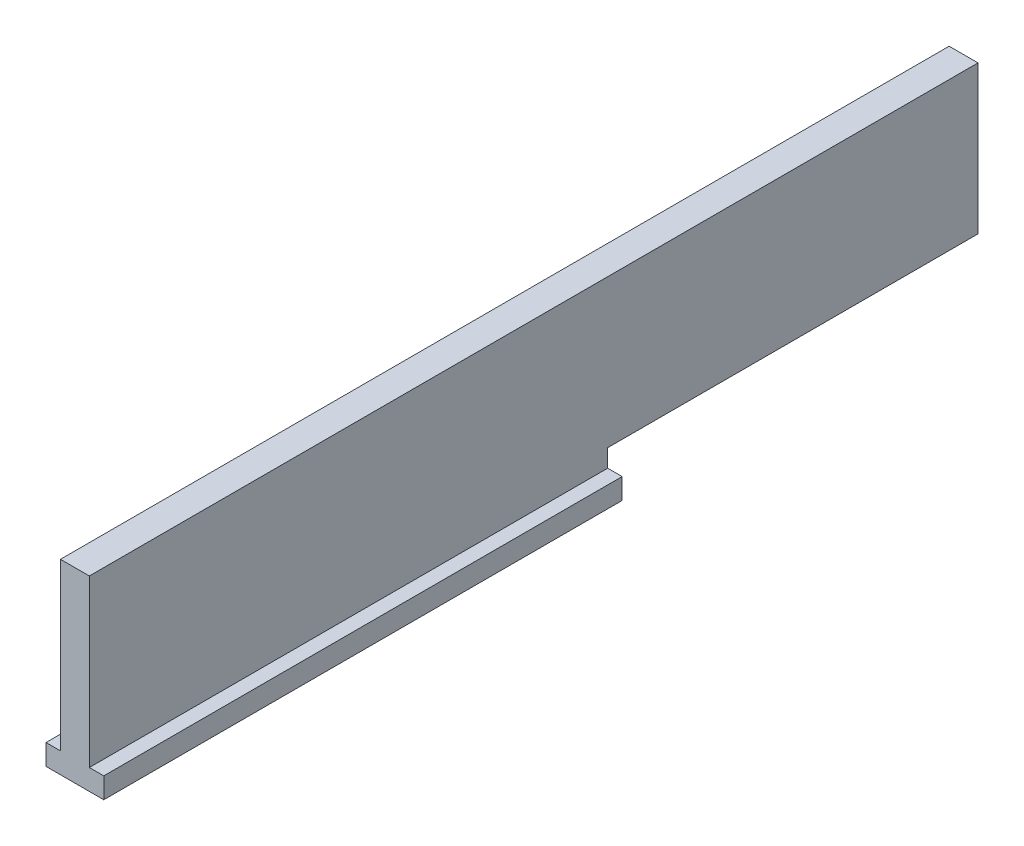
ISO-10303-21;
HEADER;
FILE_DESCRIPTION(('STEP AP214'),'2;1');
FILE_NAME('part.step','',(''),(''),'','','');
FILE_SCHEMA(('AUTOMOTIVE_DESIGN { 1 0 10303 214 1 1 1 1 }'));
ENDSEC;
DATA;
#1=APPLICATION_CONTEXT('core data for automotive mechanical design processes');
#2=APPLICATION_PROTOCOL_DEFINITION('international standard','automotive_design',2000,#1);
#3=PRODUCT_CONTEXT('',#1,'mechanical');
#4=PRODUCT('Part','Part','',(#3));
#5=PRODUCT_RELATED_PRODUCT_CATEGORY('part','',(#4));
#6=PRODUCT_DEFINITION_FORMATION('','',#4);
#7=PRODUCT_DEFINITION_CONTEXT('part definition',#1,'design');
#8=PRODUCT_DEFINITION('design','',#6,#7);
#9=PRODUCT_DEFINITION_SHAPE('','',#8);
#10=(LENGTH_UNIT() NAMED_UNIT(*) SI_UNIT(.MILLI.,.METRE.));
#11=(NAMED_UNIT(*) PLANE_ANGLE_UNIT() SI_UNIT($,.RADIAN.));
#12=(NAMED_UNIT(*) SI_UNIT($,.STERADIAN.) SOLID_ANGLE_UNIT());
#13=UNCERTAINTY_MEASURE_WITH_UNIT(LENGTH_MEASURE(1.E-05),#10,'distance_accuracy_value','');
#14=(GEOMETRIC_REPRESENTATION_CONTEXT(3) GLOBAL_UNCERTAINTY_ASSIGNED_CONTEXT((#13)) GLOBAL_UNIT_ASSIGNED_CONTEXT((#10,
#11,#12)) REPRESENTATION_CONTEXT('',''));
#15=CARTESIAN_POINT('',(0.,0.,0.));
#16=DIRECTION('',(0.,0.,1.));
#17=DIRECTION('',(1.,0.,0.));
#18=AXIS2_PLACEMENT_3D('',#15,#16,#17);
#19=CARTESIAN_POINT('',(-1.95,0.7,-35.));
#20=DIRECTION('',(0.,1.,0.));
#21=DIRECTION('',(-1.,0.,0.));
#22=AXIS2_PLACEMENT_3D('',#19,#20,#21);
#23=PLANE('',#22);
#24=DIRECTION('',(-1.,0.,0.));
#25=VECTOR('',#24,1.);
#26=CARTESIAN_POINT('',(-1.95,0.7,0.));
#27=LINE('',#26,#25);
#28=CARTESIAN_POINT('',(-0.975,0.7,0.));
#29=VERTEX_POINT('',#28);
#30=CARTESIAN_POINT('',(-1.95,0.7,0.));
#31=VERTEX_POINT('',#30);
#32=EDGE_CURVE('E150',#29,#31,#27,.T.);
#33=ORIENTED_EDGE('',*,*,#32,.F.);
#34=DIRECTION('',(0.,0.,1.));
#35=VECTOR('',#34,1.);
#36=CARTESIAN_POINT('',(-0.975,0.7,-35.));
#37=LINE('',#36,#35);
#38=CARTESIAN_POINT('',(-0.975,0.7,-35.));
#39=VERTEX_POINT('',#38);
#40=EDGE_CURVE('E11',#39,#29,#37,.T.);
#41=ORIENTED_EDGE('',*,*,#40,.F.);
#42=DIRECTION('',(-1.,0.,0.));
#43=VECTOR('',#42,1.);
#44=CARTESIAN_POINT('',(-1.95,0.7,-35.));
#45=LINE('',#44,#43);
#46=CARTESIAN_POINT('',(-1.95,0.7,-35.));
#47=VERTEX_POINT('',#46);
#48=EDGE_CURVE('E173',#39,#47,#45,.T.);
#49=ORIENTED_EDGE('',*,*,#48,.T.);
#50=DIRECTION('',(0.,0.,1.));
#51=VECTOR('',#50,1.);
#52=CARTESIAN_POINT('',(-1.95,0.7,-35.));
#53=LINE('',#52,#51);
#54=EDGE_CURVE('E48',#47,#31,#53,.T.);
#55=ORIENTED_EDGE('',*,*,#54,.T.);
#56=EDGE_LOOP('',(#33,#41,#49,#55));
#57=FACE_BOUND('',#56,.T.);
#58=ADVANCED_FACE('F44',(#57),#23,.T.);
#59=CARTESIAN_POINT('',(-0.975,0.7,-35.));
#60=DIRECTION('',(-1.,0.,0.));
#61=DIRECTION('',(0.,0.,1.));
#62=AXIS2_PLACEMENT_3D('',#59,#60,#61);
#63=PLANE('',#62);
#64=DIRECTION('',(0.,-1.,0.));
#65=VECTOR('',#64,1.);
#66=CARTESIAN_POINT('',(-0.975,0.7,0.));
#67=LINE('',#66,#65);
#68=CARTESIAN_POINT('',(-0.975,11.9,0.));
#69=VERTEX_POINT('',#68);
#70=EDGE_CURVE('E167',#69,#29,#67,.T.);
#71=ORIENTED_EDGE('',*,*,#70,.F.);
#72=DIRECTION('',(0.,0.,1.));
#73=VECTOR('',#72,1.);
#74=CARTESIAN_POINT('',(-0.975,11.9,0.));
#75=LINE('',#74,#73);
#76=CARTESIAN_POINT('',(-0.975,11.9,-60.));
#77=VERTEX_POINT('',#76);
#78=EDGE_CURVE('E192',#77,#69,#75,.T.);
#79=ORIENTED_EDGE('',*,*,#78,.F.);
#80=DIRECTION('',(0.,1.,0.));
#81=VECTOR('',#80,1.);
#82=CARTESIAN_POINT('',(-0.975,11.9,-60.));
#83=LINE('',#82,#81);
#84=CARTESIAN_POINT('',(-0.975,1.9,-60.));
#85=VERTEX_POINT('',#84);
#86=EDGE_CURVE('E207',#85,#77,#83,.T.);
#87=ORIENTED_EDGE('',*,*,#86,.F.);
#88=DIRECTION('',(0.,0.,-1.));
#89=VECTOR('',#88,1.);
#90=CARTESIAN_POINT('',(-0.975,1.9,-60.));
#91=LINE('',#90,#89);
#92=CARTESIAN_POINT('',(-0.975,1.9,-35.));
#93=VERTEX_POINT('',#92);
#94=EDGE_CURVE('E215',#93,#85,#91,.T.);
#95=ORIENTED_EDGE('',*,*,#94,.F.);
#96=DIRECTION('',(0.,-1.,0.));
#97=VECTOR('',#96,1.);
#98=CARTESIAN_POINT('',(-0.975,0.7,-35.));
#99=LINE('',#98,#97);
#100=EDGE_CURVE('E143',#93,#39,#99,.T.);
#101=ORIENTED_EDGE('',*,*,#100,.T.);
#102=ORIENTED_EDGE('',*,*,#40,.T.);
#103=EDGE_LOOP('',(#71,#79,#87,#95,#101,#102));
#104=FACE_BOUND('',#103,.T.);
#105=ADVANCED_FACE('F191',(#104),#63,.T.);
#106=CARTESIAN_POINT('',(0.975,0.7,-35.));
#107=DIRECTION('',(1.,0.,0.));
#108=DIRECTION('',(0.,0.,-1.));
#109=AXIS2_PLACEMENT_3D('',#106,#107,#108);
#110=PLANE('',#109);
#111=DIRECTION('',(0.,1.,0.));
#112=VECTOR('',#111,1.);
#113=CARTESIAN_POINT('',(0.975,0.7,0.));
#114=LINE('',#113,#112);
#115=CARTESIAN_POINT('',(0.975,0.7,0.));
#116=VERTEX_POINT('',#115);
#117=CARTESIAN_POINT('',(0.975,11.9,0.));
#118=VERTEX_POINT('',#117);
#119=EDGE_CURVE('E117',#116,#118,#114,.T.);
#120=ORIENTED_EDGE('',*,*,#119,.F.);
#121=DIRECTION('',(0.,0.,1.));
#122=VECTOR('',#121,1.);
#123=CARTESIAN_POINT('',(0.975,0.7,-35.));
#124=LINE('',#123,#122);
#125=CARTESIAN_POINT('',(0.975,0.7,-35.));
#126=VERTEX_POINT('',#125);
#127=EDGE_CURVE('E54',#126,#116,#124,.T.);
#128=ORIENTED_EDGE('',*,*,#127,.F.);
#129=DIRECTION('',(0.,1.,0.));
#130=VECTOR('',#129,1.);
#131=CARTESIAN_POINT('',(0.975,0.7,-35.));
#132=LINE('',#131,#130);
#133=CARTESIAN_POINT('',(0.975,1.9,-35.));
#134=VERTEX_POINT('',#133);
#135=EDGE_CURVE('E112',#126,#134,#132,.T.);
#136=ORIENTED_EDGE('',*,*,#135,.T.);
#137=DIRECTION('',(0.,0.,-1.));
#138=VECTOR('',#137,1.);
#139=CARTESIAN_POINT('',(0.975,1.9,-60.));
#140=LINE('',#139,#138);
#141=CARTESIAN_POINT('',(0.975,1.9,-60.));
#142=VERTEX_POINT('',#141);
#143=EDGE_CURVE('E204',#134,#142,#140,.T.);
#144=ORIENTED_EDGE('',*,*,#143,.T.);
#145=DIRECTION('',(0.,1.,0.));
#146=VECTOR('',#145,1.);
#147=CARTESIAN_POINT('',(0.975,11.9,-60.));
#148=LINE('',#147,#146);
#149=CARTESIAN_POINT('',(0.975,11.9,-60.));
#150=VERTEX_POINT('',#149);
#151=EDGE_CURVE('E208',#142,#150,#148,.T.);
#152=ORIENTED_EDGE('',*,*,#151,.T.);
#153=DIRECTION('',(0.,0.,1.));
#154=VECTOR('',#153,1.);
#155=CARTESIAN_POINT('',(0.975,11.9,0.));
#156=LINE('',#155,#154);
#157=EDGE_CURVE('E218',#150,#118,#156,.T.);
#158=ORIENTED_EDGE('',*,*,#157,.T.);
#159=EDGE_LOOP('',(#120,#128,#136,#144,#152,#158));
#160=FACE_BOUND('',#159,.T.);
#161=ADVANCED_FACE('F115',(#160),#110,.T.);
#162=CARTESIAN_POINT('',(1.95,0.7,-35.));
#163=DIRECTION('',(0.,1.,0.));
#164=DIRECTION('',(-1.,0.,0.));
#165=AXIS2_PLACEMENT_3D('',#162,#163,#164);
#166=PLANE('',#165);
#167=DIRECTION('',(-1.,0.,0.));
#168=VECTOR('',#167,1.);
#169=CARTESIAN_POINT('',(1.95,0.7,0.));
#170=LINE('',#169,#168);
#171=CARTESIAN_POINT('',(1.95,0.7,0.));
#172=VERTEX_POINT('',#171);
#173=EDGE_CURVE('E164',#172,#116,#170,.T.);
#174=ORIENTED_EDGE('',*,*,#173,.F.);
#175=DIRECTION('',(0.,0.,1.));
#176=VECTOR('',#175,1.);
#177=CARTESIAN_POINT('',(1.95,0.7,-35.));
#178=LINE('',#177,#176);
#179=CARTESIAN_POINT('',(1.95,0.7,-35.));
#180=VERTEX_POINT('',#179);
#181=EDGE_CURVE('E122',#180,#172,#178,.T.);
#182=ORIENTED_EDGE('',*,*,#181,.F.);
#183=DIRECTION('',(-1.,0.,0.));
#184=VECTOR('',#183,1.);
#185=CARTESIAN_POINT('',(1.95,0.7,-35.));
#186=LINE('',#185,#184);
#187=EDGE_CURVE('E126',#180,#126,#186,.T.);
#188=ORIENTED_EDGE('',*,*,#187,.T.);
#189=ORIENTED_EDGE('',*,*,#127,.T.);
#190=EDGE_LOOP('',(#174,#182,#188,#189));
#191=FACE_BOUND('',#190,.T.);
#192=ADVANCED_FACE('F133',(#191),#166,.T.);
#193=CARTESIAN_POINT('',(1.95,0.7,-35.));
#194=DIRECTION('',(1.,0.,0.));
#195=DIRECTION('',(0.,1.,0.));
#196=AXIS2_PLACEMENT_3D('',#193,#194,#195);
#197=PLANE('',#196);
#198=DIRECTION('',(0.,1.,0.));
#199=VECTOR('',#198,1.);
#200=CARTESIAN_POINT('',(1.95,0.7,0.));
#201=LINE('',#200,#199);
#202=CARTESIAN_POINT('',(1.95,-0.7,0.));
#203=VERTEX_POINT('',#202);
#204=EDGE_CURVE('E163',#203,#172,#201,.T.);
#205=ORIENTED_EDGE('',*,*,#204,.F.);
#206=DIRECTION('',(0.,0.,1.));
#207=VECTOR('',#206,1.);
#208=CARTESIAN_POINT('',(1.95,-0.7,-35.));
#209=LINE('',#208,#207);
#210=CARTESIAN_POINT('',(1.95,-0.7,-35.));
#211=VERTEX_POINT('',#210);
#212=EDGE_CURVE('E180',#211,#203,#209,.T.);
#213=ORIENTED_EDGE('',*,*,#212,.F.);
#214=DIRECTION('',(0.,1.,0.));
#215=VECTOR('',#214,1.);
#216=CARTESIAN_POINT('',(1.95,0.7,-35.));
#217=LINE('',#216,#215);
#218=EDGE_CURVE('E136',#211,#180,#217,.T.);
#219=ORIENTED_EDGE('',*,*,#218,.T.);
#220=ORIENTED_EDGE('',*,*,#181,.T.);
#221=EDGE_LOOP('',(#205,#213,#219,#220));
#222=FACE_BOUND('',#221,.T.);
#223=ADVANCED_FACE('F236',(#222),#197,.T.);
#224=CARTESIAN_POINT('',(-1.95,-0.7,-35.));
#225=DIRECTION('',(0.,-1.,0.));
#226=DIRECTION('',(0.,0.,-1.));
#227=AXIS2_PLACEMENT_3D('',#224,#225,#226);
#228=PLANE('',#227);
#229=DIRECTION('',(1.,0.,0.));
#230=VECTOR('',#229,1.);
#231=CARTESIAN_POINT('',(-1.95,-0.7,0.));
#232=LINE('',#231,#230);
#233=CARTESIAN_POINT('',(-1.95,-0.7,0.));
#234=VERTEX_POINT('',#233);
#235=EDGE_CURVE('E160',#234,#203,#232,.T.);
#236=ORIENTED_EDGE('',*,*,#235,.F.);
#237=DIRECTION('',(0.,0.,1.));
#238=VECTOR('',#237,1.);
#239=CARTESIAN_POINT('',(-1.95,-0.7,-35.));
#240=LINE('',#239,#238);
#241=CARTESIAN_POINT('',(-1.95,-0.7,-35.));
#242=VERTEX_POINT('',#241);
#243=EDGE_CURVE('E177',#242,#234,#240,.T.);
#244=ORIENTED_EDGE('',*,*,#243,.F.);
#245=DIRECTION('',(1.,0.,0.));
#246=VECTOR('',#245,1.);
#247=CARTESIAN_POINT('',(-1.95,-0.7,-35.));
#248=LINE('',#247,#246);
#249=EDGE_CURVE('E138',#242,#211,#248,.T.);
#250=ORIENTED_EDGE('',*,*,#249,.T.);
#251=ORIENTED_EDGE('',*,*,#212,.T.);
#252=EDGE_LOOP('',(#236,#244,#250,#251));
#253=FACE_BOUND('',#252,.T.);
#254=ADVANCED_FACE('F231',(#253),#228,.T.);
#255=CARTESIAN_POINT('',(-1.95,-0.7,-35.));
#256=DIRECTION('',(-1.,0.,0.));
#257=DIRECTION('',(0.,-1.,0.));
#258=AXIS2_PLACEMENT_3D('',#255,#256,#257);
#259=PLANE('',#258);
#260=DIRECTION('',(0.,-1.,0.));
#261=VECTOR('',#260,1.);
#262=CARTESIAN_POINT('',(-1.95,-0.7,0.));
#263=LINE('',#262,#261);
#264=EDGE_CURVE('E155',#31,#234,#263,.T.);
#265=ORIENTED_EDGE('',*,*,#264,.F.);
#266=ORIENTED_EDGE('',*,*,#54,.F.);
#267=DIRECTION('',(0.,-1.,0.));
#268=VECTOR('',#267,1.);
#269=CARTESIAN_POINT('',(-1.95,-0.7,-35.));
#270=LINE('',#269,#268);
#271=EDGE_CURVE('E227',#47,#242,#270,.T.);
#272=ORIENTED_EDGE('',*,*,#271,.T.);
#273=ORIENTED_EDGE('',*,*,#243,.T.);
#274=EDGE_LOOP('',(#265,#266,#272,#273));
#275=FACE_BOUND('',#274,.T.);
#276=ADVANCED_FACE('F182',(#275),#259,.T.);
#277=CARTESIAN_POINT('',(0.,0.,-35.));
#278=DIRECTION('',(0.,0.,1.));
#279=DIRECTION('',(1.,0.,0.));
#280=AXIS2_PLACEMENT_3D('',#277,#278,#279);
#281=PLANE('',#280);
#282=ORIENTED_EDGE('',*,*,#48,.F.);
#283=ORIENTED_EDGE('',*,*,#100,.F.);
#284=DIRECTION('',(-1.,0.,0.));
#285=VECTOR('',#284,1.);
#286=CARTESIAN_POINT('',(-0.975,1.9,-35.));
#287=LINE('',#286,#285);
#288=EDGE_CURVE('E131',#134,#93,#287,.T.);
#289=ORIENTED_EDGE('',*,*,#288,.F.);
#290=ORIENTED_EDGE('',*,*,#135,.F.);
#291=ORIENTED_EDGE('',*,*,#187,.F.);
#292=ORIENTED_EDGE('',*,*,#218,.F.);
#293=ORIENTED_EDGE('',*,*,#249,.F.);
#294=ORIENTED_EDGE('',*,*,#271,.F.);
#295=EDGE_LOOP('',(#282,#283,#289,#290,#291,#292,#293,#294));
#296=FACE_BOUND('',#295,.T.);
#297=ADVANCED_FACE('F123',(#296),#281,.F.);
#298=CARTESIAN_POINT('',(0.,0.,0.));
#299=DIRECTION('',(0.,0.,1.));
#300=DIRECTION('',(1.,0.,0.));
#301=AXIS2_PLACEMENT_3D('',#298,#299,#300);
#302=PLANE('',#301);
#303=ORIENTED_EDGE('',*,*,#32,.T.);
#304=ORIENTED_EDGE('',*,*,#264,.T.);
#305=ORIENTED_EDGE('',*,*,#235,.T.);
#306=ORIENTED_EDGE('',*,*,#204,.T.);
#307=ORIENTED_EDGE('',*,*,#173,.T.);
#308=ORIENTED_EDGE('',*,*,#119,.T.);
#309=DIRECTION('',(-1.,0.,0.));
#310=VECTOR('',#309,1.);
#311=CARTESIAN_POINT('',(0.975,11.9,0.));
#312=LINE('',#311,#310);
#313=EDGE_CURVE('E186',#118,#69,#312,.T.);
#314=ORIENTED_EDGE('',*,*,#313,.T.);
#315=ORIENTED_EDGE('',*,*,#70,.T.);
#316=EDGE_LOOP('',(#303,#304,#305,#306,#307,#308,#314,#315));
#317=FACE_BOUND('',#316,.T.);
#318=ADVANCED_FACE('F184',(#317),#302,.T.);
#319=CARTESIAN_POINT('',(0.975,1.9,-60.));
#320=DIRECTION('',(0.,1.,0.));
#321=DIRECTION('',(0.,0.,1.));
#322=AXIS2_PLACEMENT_3D('',#319,#320,#321);
#323=PLANE('',#322);
#324=ORIENTED_EDGE('',*,*,#143,.F.);
#325=ORIENTED_EDGE('',*,*,#288,.T.);
#326=ORIENTED_EDGE('',*,*,#94,.T.);
#327=DIRECTION('',(-1.,0.,0.));
#328=VECTOR('',#327,1.);
#329=CARTESIAN_POINT('',(0.975,1.9,-60.));
#330=LINE('',#329,#328);
#331=EDGE_CURVE('E152',#142,#85,#330,.T.);
#332=ORIENTED_EDGE('',*,*,#331,.F.);
#333=EDGE_LOOP('',(#324,#325,#326,#332));
#334=FACE_BOUND('',#333,.T.);
#335=ADVANCED_FACE('F252',(#334),#323,.F.);
#336=CARTESIAN_POINT('',(0.975,11.9,-60.));
#337=DIRECTION('',(0.,0.,1.));
#338=DIRECTION('',(1.,0.,0.));
#339=AXIS2_PLACEMENT_3D('',#336,#337,#338);
#340=PLANE('',#339);
#341=ORIENTED_EDGE('',*,*,#86,.T.);
#342=DIRECTION('',(-1.,0.,0.));
#343=VECTOR('',#342,1.);
#344=CARTESIAN_POINT('',(0.975,11.9,-60.));
#345=LINE('',#344,#343);
#346=EDGE_CURVE('E202',#150,#77,#345,.T.);
#347=ORIENTED_EDGE('',*,*,#346,.F.);
#348=ORIENTED_EDGE('',*,*,#151,.F.);
#349=ORIENTED_EDGE('',*,*,#331,.T.);
#350=EDGE_LOOP('',(#341,#347,#348,#349));
#351=FACE_BOUND('',#350,.T.);
#352=ADVANCED_FACE('F251',(#351),#340,.F.);
#353=CARTESIAN_POINT('',(0.975,11.9,0.));
#354=DIRECTION('',(0.,-1.,0.));
#355=DIRECTION('',(0.,0.,-1.));
#356=AXIS2_PLACEMENT_3D('',#353,#354,#355);
#357=PLANE('',#356);
#358=ORIENTED_EDGE('',*,*,#78,.T.);
#359=ORIENTED_EDGE('',*,*,#313,.F.);
#360=ORIENTED_EDGE('',*,*,#157,.F.);
#361=ORIENTED_EDGE('',*,*,#346,.T.);
#362=EDGE_LOOP('',(#358,#359,#360,#361));
#363=FACE_BOUND('',#362,.T.);
#364=ADVANCED_FACE('F198',(#363),#357,.F.);
#365=CLOSED_SHELL('',(#58,#105,#161,#192,#223,#254,#276,#297,#318,#335,#352,#364));
#366=MANIFOLD_SOLID_BREP('B2',#365);
#367=ADVANCED_BREP_SHAPE_REPRESENTATION('',(#18,#366),#14);
#368=SHAPE_DEFINITION_REPRESENTATION(#9,#367);
ENDSEC;
END-ISO-10303-21;
